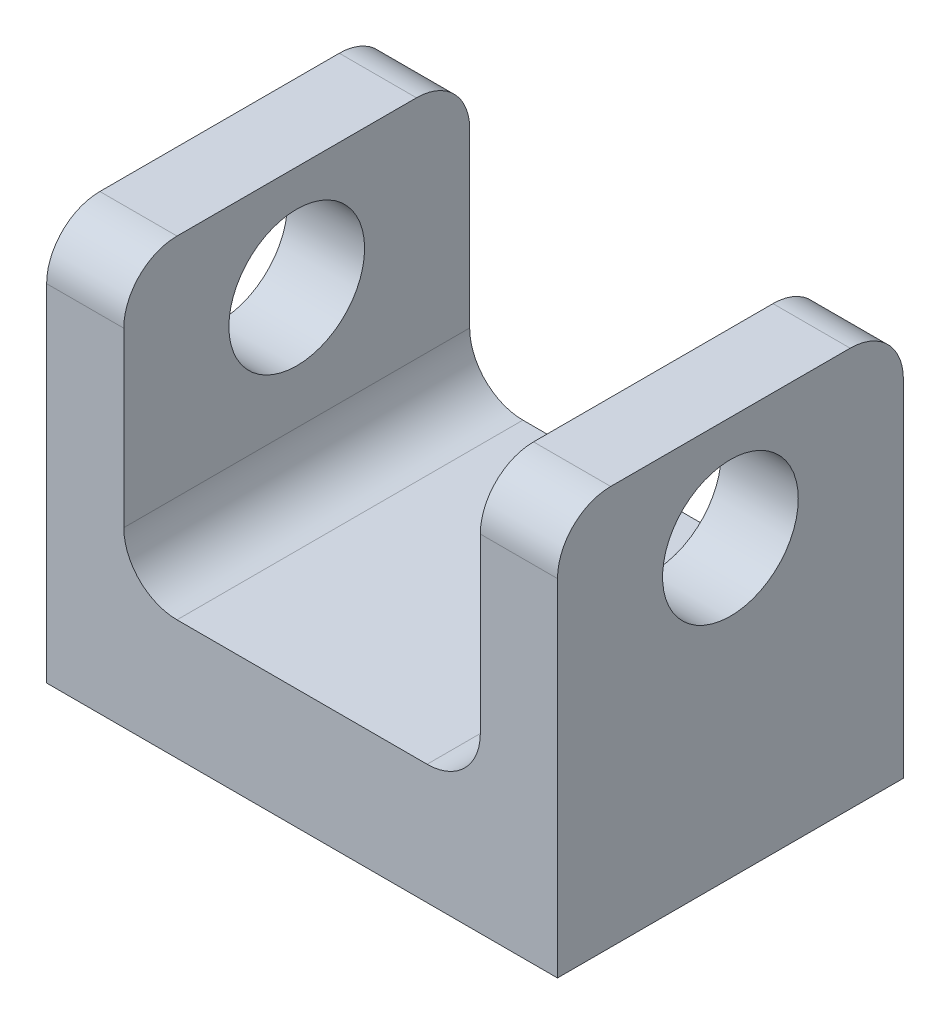
ISO-10303-21;
HEADER;
FILE_DESCRIPTION(('STEP AP214'),'2;1');
FILE_NAME('part.step','',(''),(''),'','','');
FILE_SCHEMA(('AUTOMOTIVE_DESIGN { 1 0 10303 214 1 1 1 1 }'));
ENDSEC;
DATA;
#1=APPLICATION_CONTEXT('core data for automotive mechanical design processes');
#2=APPLICATION_PROTOCOL_DEFINITION('international standard','automotive_design',2000,#1);
#3=PRODUCT_CONTEXT('',#1,'mechanical');
#4=PRODUCT('Part','Part','',(#3));
#5=PRODUCT_RELATED_PRODUCT_CATEGORY('part','',(#4));
#6=PRODUCT_DEFINITION_FORMATION('','',#4);
#7=PRODUCT_DEFINITION_CONTEXT('part definition',#1,'design');
#8=PRODUCT_DEFINITION('design','',#6,#7);
#9=PRODUCT_DEFINITION_SHAPE('','',#8);
#10=(LENGTH_UNIT() NAMED_UNIT(*) SI_UNIT(.MILLI.,.METRE.));
#11=(NAMED_UNIT(*) PLANE_ANGLE_UNIT() SI_UNIT($,.RADIAN.));
#12=(NAMED_UNIT(*) SI_UNIT($,.STERADIAN.) SOLID_ANGLE_UNIT());
#13=UNCERTAINTY_MEASURE_WITH_UNIT(LENGTH_MEASURE(1.E-05),#10,'distance_accuracy_value','');
#14=(GEOMETRIC_REPRESENTATION_CONTEXT(3) GLOBAL_UNCERTAINTY_ASSIGNED_CONTEXT((#13)) GLOBAL_UNIT_ASSIGNED_CONTEXT((#10,
#11,#12)) REPRESENTATION_CONTEXT('',''));
#15=CARTESIAN_POINT('',(0.,0.,0.));
#16=DIRECTION('',(0.,0.,1.));
#17=DIRECTION('',(1.,0.,0.));
#18=AXIS2_PLACEMENT_3D('',#15,#16,#17);
#19=CARTESIAN_POINT('',(-48.,37.5,65.));
#20=DIRECTION('',(0.,-1.,0.));
#21=DIRECTION('',(0.,0.,-1.));
#22=AXIS2_PLACEMENT_3D('',#19,#20,#21);
#23=PLANE('',#22);
#24=DIRECTION('',(0.,0.,-1.));
#25=VECTOR('',#24,1.);
#26=CARTESIAN_POINT('',(48.,37.5,65.));
#27=LINE('',#26,#25);
#28=CARTESIAN_POINT('',(48.,37.5,55.));
#29=VERTEX_POINT('',#28);
#30=CARTESIAN_POINT('',(48.,37.5,10.));
#31=VERTEX_POINT('',#30);
#32=EDGE_CURVE('E186',#29,#31,#27,.T.);
#33=ORIENTED_EDGE('',*,*,#32,.T.);
#34=DIRECTION('',(-1.,0.,0.));
#35=VECTOR('',#34,1.);
#36=CARTESIAN_POINT('',(33.5,37.5,10.));
#37=LINE('',#36,#35);
#38=CARTESIAN_POINT('',(33.5,37.5,10.));
#39=VERTEX_POINT('',#38);
#40=EDGE_CURVE('E203',#31,#39,#37,.T.);
#41=ORIENTED_EDGE('',*,*,#40,.T.);
#42=DIRECTION('',(0.,0.,1.));
#43=VECTOR('',#42,1.);
#44=CARTESIAN_POINT('',(33.5,37.5,65.));
#45=LINE('',#44,#43);
#46=CARTESIAN_POINT('',(33.5,37.5,55.));
#47=VERTEX_POINT('',#46);
#48=EDGE_CURVE('E178',#39,#47,#45,.T.);
#49=ORIENTED_EDGE('',*,*,#48,.T.);
#50=DIRECTION('',(-1.,0.,0.));
#51=VECTOR('',#50,1.);
#52=CARTESIAN_POINT('',(-48.,37.5,55.));
#53=LINE('',#52,#51);
#54=EDGE_CURVE('E194',#47,#29,#53,.F.);
#55=ORIENTED_EDGE('',*,*,#54,.T.);
#56=EDGE_LOOP('',(#33,#41,#49,#55));
#57=FACE_BOUND('',#56,.T.);
#58=ADVANCED_FACE('F39',(#57),#23,.F.);
#59=CARTESIAN_POINT('',(48.,-37.5,65.));
#60=DIRECTION('',(-1.,0.,0.));
#61=DIRECTION('',(0.,0.,1.));
#62=AXIS2_PLACEMENT_3D('',#59,#60,#61);
#63=PLANE('',#62);
#64=CARTESIAN_POINT('',(48.,17.8788932518614,32.5));
#65=DIRECTION('',(1.,0.,0.));
#66=DIRECTION('',(0.,0.,-1.));
#67=AXIS2_PLACEMENT_3D('',#64,#65,#66);
#68=CIRCLE('',#67,12.75);
#69=CARTESIAN_POINT('',(48.,17.8788932518614,19.75));
#70=VERTEX_POINT('',#69);
#71=EDGE_CURVE('E500',#70,#70,#68,.T.);
#72=ORIENTED_EDGE('',*,*,#71,.F.);
#73=EDGE_LOOP('',(#72));
#74=FACE_BOUND('',#73,.T.);
#75=DIRECTION('',(0.,1.,0.));
#76=VECTOR('',#75,1.);
#77=CARTESIAN_POINT('',(48.,-37.5,0.));
#78=LINE('',#77,#76);
#79=CARTESIAN_POINT('',(48.,-37.5,0.));
#80=VERTEX_POINT('',#79);
#81=CARTESIAN_POINT('',(48.,27.5,0.));
#82=VERTEX_POINT('',#81);
#83=EDGE_CURVE('E174',#80,#82,#78,.T.);
#84=ORIENTED_EDGE('',*,*,#83,.T.);
#85=CARTESIAN_POINT('',(48.,27.5,10.));
#86=DIRECTION('',(-1.,0.,0.));
#87=DIRECTION('',(0.,0.,1.));
#88=AXIS2_PLACEMENT_3D('',#85,#86,#87);
#89=CIRCLE('',#88,10.);
#90=EDGE_CURVE('E226',#82,#31,#89,.F.);
#91=ORIENTED_EDGE('',*,*,#90,.T.);
#92=ORIENTED_EDGE('',*,*,#32,.F.);
#93=CARTESIAN_POINT('',(48.,27.5,55.));
#94=DIRECTION('',(-1.,0.,0.));
#95=DIRECTION('',(0.,0.,1.));
#96=AXIS2_PLACEMENT_3D('',#93,#94,#95);
#97=CIRCLE('',#96,10.);
#98=CARTESIAN_POINT('',(48.,27.5,65.));
#99=VERTEX_POINT('',#98);
#100=EDGE_CURVE('E223',#29,#99,#97,.F.);
#101=ORIENTED_EDGE('',*,*,#100,.T.);
#102=DIRECTION('',(0.,1.,0.));
#103=VECTOR('',#102,1.);
#104=CARTESIAN_POINT('',(48.,-37.5,65.));
#105=LINE('',#104,#103);
#106=CARTESIAN_POINT('',(48.,-37.5,65.));
#107=VERTEX_POINT('',#106);
#108=EDGE_CURVE('E152',#107,#99,#105,.T.);
#109=ORIENTED_EDGE('',*,*,#108,.F.);
#110=DIRECTION('',(0.,0.,-1.));
#111=VECTOR('',#110,1.);
#112=CARTESIAN_POINT('',(48.,-37.5,65.));
#113=LINE('',#112,#111);
#114=EDGE_CURVE('E163',#107,#80,#113,.T.);
#115=ORIENTED_EDGE('',*,*,#114,.T.);
#116=EDGE_LOOP('',(#84,#91,#92,#101,#109,#115));
#117=FACE_BOUND('',#116,.T.);
#118=ADVANCED_FACE('F345',(#74,#117),#63,.F.);
#119=DIRECTION('',(0.,0.,-1.));
#120=VECTOR('',#119,1.);
#121=CARTESIAN_POINT('',(-33.5,37.5,65.));
#122=LINE('',#121,#120);
#123=CARTESIAN_POINT('',(-33.5,37.5,55.));
#124=VERTEX_POINT('',#123);
#125=CARTESIAN_POINT('',(-33.5,37.5,10.));
#126=VERTEX_POINT('',#125);
#127=EDGE_CURVE('E295',#124,#126,#122,.T.);
#128=ORIENTED_EDGE('',*,*,#127,.T.);
#129=DIRECTION('',(-1.,0.,0.));
#130=VECTOR('',#129,1.);
#131=CARTESIAN_POINT('',(-48.,37.5,10.));
#132=LINE('',#131,#130);
#133=CARTESIAN_POINT('',(-48.,37.5,10.));
#134=VERTEX_POINT('',#133);
#135=EDGE_CURVE('E238',#126,#134,#132,.T.);
#136=ORIENTED_EDGE('',*,*,#135,.T.);
#137=DIRECTION('',(0.,0.,-1.));
#138=VECTOR('',#137,1.);
#139=CARTESIAN_POINT('',(-48.,37.5,65.));
#140=LINE('',#139,#138);
#141=CARTESIAN_POINT('',(-48.,37.5,55.));
#142=VERTEX_POINT('',#141);
#143=EDGE_CURVE('E162',#142,#134,#140,.T.);
#144=ORIENTED_EDGE('',*,*,#143,.F.);
#145=DIRECTION('',(-1.,0.,0.));
#146=VECTOR('',#145,1.);
#147=CARTESIAN_POINT('',(-48.,37.5,55.));
#148=LINE('',#147,#146);
#149=EDGE_CURVE('E235',#142,#124,#148,.F.);
#150=ORIENTED_EDGE('',*,*,#149,.T.);
#151=EDGE_LOOP('',(#128,#136,#144,#150));
#152=FACE_BOUND('',#151,.T.);
#153=ADVANCED_FACE('F347',(#152),#23,.F.);
#154=CARTESIAN_POINT('',(-48.,-37.5,65.));
#155=DIRECTION('',(1.,0.,0.));
#156=DIRECTION('',(0.,0.,-1.));
#157=AXIS2_PLACEMENT_3D('',#154,#155,#156);
#158=PLANE('',#157);
#159=CARTESIAN_POINT('',(-48.,17.8788932518614,32.5));
#160=DIRECTION('',(1.,0.,0.));
#161=DIRECTION('',(0.,0.,-1.));
#162=AXIS2_PLACEMENT_3D('',#159,#160,#161);
#163=CIRCLE('',#162,12.75);
#164=CARTESIAN_POINT('',(-48.,17.8788932518614,19.75));
#165=VERTEX_POINT('',#164);
#166=EDGE_CURVE('E200',#165,#165,#163,.T.);
#167=ORIENTED_EDGE('',*,*,#166,.T.);
#168=EDGE_LOOP('',(#167));
#169=FACE_BOUND('',#168,.T.);
#170=ORIENTED_EDGE('',*,*,#143,.T.);
#171=CARTESIAN_POINT('',(-48.,27.5,10.));
#172=DIRECTION('',(1.,0.,0.));
#173=DIRECTION('',(0.,0.,-1.));
#174=AXIS2_PLACEMENT_3D('',#171,#172,#173);
#175=CIRCLE('',#174,10.);
#176=CARTESIAN_POINT('',(-48.,27.5,0.));
#177=VERTEX_POINT('',#176);
#178=EDGE_CURVE('E55',#134,#177,#175,.F.);
#179=ORIENTED_EDGE('',*,*,#178,.T.);
#180=DIRECTION('',(0.,-1.,0.));
#181=VECTOR('',#180,1.);
#182=CARTESIAN_POINT('',(-48.,-37.5,0.));
#183=LINE('',#182,#181);
#184=CARTESIAN_POINT('',(-48.,-37.5,0.));
#185=VERTEX_POINT('',#184);
#186=EDGE_CURVE('E158',#177,#185,#183,.T.);
#187=ORIENTED_EDGE('',*,*,#186,.T.);
#188=DIRECTION('',(0.,0.,-1.));
#189=VECTOR('',#188,1.);
#190=CARTESIAN_POINT('',(-48.,-37.5,65.));
#191=LINE('',#190,#189);
#192=CARTESIAN_POINT('',(-48.,-37.5,65.));
#193=VERTEX_POINT('',#192);
#194=EDGE_CURVE('E155',#193,#185,#191,.T.);
#195=ORIENTED_EDGE('',*,*,#194,.F.);
#196=DIRECTION('',(0.,-1.,0.));
#197=VECTOR('',#196,1.);
#198=CARTESIAN_POINT('',(-48.,-37.5,65.));
#199=LINE('',#198,#197);
#200=CARTESIAN_POINT('',(-48.,27.5,65.));
#201=VERTEX_POINT('',#200);
#202=EDGE_CURVE('E141',#201,#193,#199,.T.);
#203=ORIENTED_EDGE('',*,*,#202,.F.);
#204=CARTESIAN_POINT('',(-48.,27.5,55.));
#205=DIRECTION('',(1.,0.,0.));
#206=DIRECTION('',(0.,0.,-1.));
#207=AXIS2_PLACEMENT_3D('',#204,#205,#206);
#208=CIRCLE('',#207,10.);
#209=EDGE_CURVE('E63',#201,#142,#208,.F.);
#210=ORIENTED_EDGE('',*,*,#209,.T.);
#211=EDGE_LOOP('',(#170,#179,#187,#195,#203,#210));
#212=FACE_BOUND('',#211,.T.);
#213=ADVANCED_FACE('F156',(#169,#212),#158,.F.);
#214=CARTESIAN_POINT('',(-48.,-37.5,65.));
#215=DIRECTION('',(0.,1.,0.));
#216=DIRECTION('',(0.,0.,1.));
#217=AXIS2_PLACEMENT_3D('',#214,#215,#216);
#218=PLANE('',#217);
#219=DIRECTION('',(1.,0.,0.));
#220=VECTOR('',#219,1.);
#221=CARTESIAN_POINT('',(-48.,-37.5,0.));
#222=LINE('',#221,#220);
#223=EDGE_CURVE('E181',#185,#80,#222,.T.);
#224=ORIENTED_EDGE('',*,*,#223,.T.);
#225=ORIENTED_EDGE('',*,*,#114,.F.);
#226=DIRECTION('',(1.,0.,0.));
#227=VECTOR('',#226,1.);
#228=CARTESIAN_POINT('',(-48.,-37.5,65.));
#229=LINE('',#228,#227);
#230=EDGE_CURVE('E146',#193,#107,#229,.T.);
#231=ORIENTED_EDGE('',*,*,#230,.F.);
#232=ORIENTED_EDGE('',*,*,#194,.T.);
#233=EDGE_LOOP('',(#224,#225,#231,#232));
#234=FACE_BOUND('',#233,.T.);
#235=ADVANCED_FACE('F165',(#234),#218,.F.);
#236=CARTESIAN_POINT('',(0.,0.,65.));
#237=DIRECTION('',(0.,0.,-1.));
#238=DIRECTION('',(-1.,0.,0.));
#239=AXIS2_PLACEMENT_3D('',#236,#237,#238);
#240=PLANE('',#239);
#241=ORIENTED_EDGE('',*,*,#108,.T.);
#242=DIRECTION('',(-1.,0.,0.));
#243=VECTOR('',#242,1.);
#244=CARTESIAN_POINT('',(0.,27.5,65.));
#245=LINE('',#244,#243);
#246=CARTESIAN_POINT('',(33.5,27.5,65.));
#247=VERTEX_POINT('',#246);
#248=EDGE_CURVE('E231',#99,#247,#245,.T.);
#249=ORIENTED_EDGE('',*,*,#248,.T.);
#250=DIRECTION('',(0.,1.,0.));
#251=VECTOR('',#250,1.);
#252=CARTESIAN_POINT('',(33.5,-14.9602041854541,65.));
#253=LINE('',#252,#251);
#254=CARTESIAN_POINT('',(33.5,-4.96020418545413,65.));
#255=VERTEX_POINT('',#254);
#256=EDGE_CURVE('E281',#255,#247,#253,.T.);
#257=ORIENTED_EDGE('',*,*,#256,.F.);
#258=CARTESIAN_POINT('',(23.5,-4.96020418545413,65.));
#259=DIRECTION('',(0.,0.,-1.));
#260=DIRECTION('',(-1.,0.,0.));
#261=AXIS2_PLACEMENT_3D('',#258,#259,#260);
#262=CIRCLE('',#261,10.);
#263=CARTESIAN_POINT('',(23.5,-14.9602041854541,65.));
#264=VERTEX_POINT('',#263);
#265=EDGE_CURVE('E261',#255,#264,#262,.T.);
#266=ORIENTED_EDGE('',*,*,#265,.T.);
#267=DIRECTION('',(1.,0.,0.));
#268=VECTOR('',#267,1.);
#269=CARTESIAN_POINT('',(-33.5,-14.9602041854541,65.));
#270=LINE('',#269,#268);
#271=CARTESIAN_POINT('',(-23.5,-14.9602041854541,65.));
#272=VERTEX_POINT('',#271);
#273=EDGE_CURVE('E271',#272,#264,#270,.T.);
#274=ORIENTED_EDGE('',*,*,#273,.F.);
#275=CARTESIAN_POINT('',(-23.5,-4.96020418545413,65.));
#276=DIRECTION('',(0.,0.,-1.));
#277=DIRECTION('',(-1.,0.,0.));
#278=AXIS2_PLACEMENT_3D('',#275,#276,#277);
#279=CIRCLE('',#278,10.);
#280=CARTESIAN_POINT('',(-33.5,-4.96020418545413,65.));
#281=VERTEX_POINT('',#280);
#282=EDGE_CURVE('E48',#272,#281,#279,.T.);
#283=ORIENTED_EDGE('',*,*,#282,.T.);
#284=DIRECTION('',(0.,-1.,0.));
#285=VECTOR('',#284,1.);
#286=CARTESIAN_POINT('',(-33.5,-14.9602041854541,65.));
#287=LINE('',#286,#285);
#288=CARTESIAN_POINT('',(-33.5,27.5,65.));
#289=VERTEX_POINT('',#288);
#290=EDGE_CURVE('E269',#289,#281,#287,.T.);
#291=ORIENTED_EDGE('',*,*,#290,.F.);
#292=DIRECTION('',(-1.,0.,0.));
#293=VECTOR('',#292,1.);
#294=CARTESIAN_POINT('',(0.,27.5,65.));
#295=LINE('',#294,#293);
#296=EDGE_CURVE('E150',#289,#201,#295,.T.);
#297=ORIENTED_EDGE('',*,*,#296,.T.);
#298=ORIENTED_EDGE('',*,*,#202,.T.);
#299=ORIENTED_EDGE('',*,*,#230,.T.);
#300=EDGE_LOOP('',(#241,#249,#257,#266,#274,#283,#291,#297,#298,#299));
#301=FACE_BOUND('',#300,.T.);
#302=ADVANCED_FACE('F144',(#301),#240,.F.);
#303=CARTESIAN_POINT('',(0.,0.,0.));
#304=DIRECTION('',(0.,0.,-1.));
#305=DIRECTION('',(-1.,0.,0.));
#306=AXIS2_PLACEMENT_3D('',#303,#304,#305);
#307=PLANE('',#306);
#308=DIRECTION('',(0.,1.,0.));
#309=VECTOR('',#308,1.);
#310=CARTESIAN_POINT('',(33.5,-14.9602041854541,0.));
#311=LINE('',#310,#309);
#312=CARTESIAN_POINT('',(33.5,-4.96020418545413,0.));
#313=VERTEX_POINT('',#312);
#314=CARTESIAN_POINT('',(33.5,27.5,0.));
#315=VERTEX_POINT('',#314);
#316=EDGE_CURVE('E296',#313,#315,#311,.T.);
#317=ORIENTED_EDGE('',*,*,#316,.T.);
#318=DIRECTION('',(-1.,0.,0.));
#319=VECTOR('',#318,1.);
#320=CARTESIAN_POINT('',(48.,27.5,0.));
#321=LINE('',#320,#319);
#322=EDGE_CURVE('E220',#315,#82,#321,.F.);
#323=ORIENTED_EDGE('',*,*,#322,.T.);
#324=ORIENTED_EDGE('',*,*,#83,.F.);
#325=ORIENTED_EDGE('',*,*,#223,.F.);
#326=ORIENTED_EDGE('',*,*,#186,.F.);
#327=DIRECTION('',(-1.,0.,0.));
#328=VECTOR('',#327,1.);
#329=CARTESIAN_POINT('',(-33.5,27.5,0.));
#330=LINE('',#329,#328);
#331=CARTESIAN_POINT('',(-33.5,27.5,0.));
#332=VERTEX_POINT('',#331);
#333=EDGE_CURVE('E217',#177,#332,#330,.F.);
#334=ORIENTED_EDGE('',*,*,#333,.T.);
#335=DIRECTION('',(0.,1.,0.));
#336=VECTOR('',#335,1.);
#337=CARTESIAN_POINT('',(-33.5,0.,0.));
#338=LINE('',#337,#336);
#339=CARTESIAN_POINT('',(-33.5,-4.96020418545413,0.));
#340=VERTEX_POINT('',#339);
#341=EDGE_CURVE('E190',#340,#332,#338,.T.);
#342=ORIENTED_EDGE('',*,*,#341,.F.);
#343=CARTESIAN_POINT('',(-23.5,-4.96020418545413,0.));
#344=DIRECTION('',(0.,0.,-1.));
#345=DIRECTION('',(-1.,0.,0.));
#346=AXIS2_PLACEMENT_3D('',#343,#344,#345);
#347=CIRCLE('',#346,10.);
#348=CARTESIAN_POINT('',(-23.5,-14.9602041854541,0.));
#349=VERTEX_POINT('',#348);
#350=EDGE_CURVE('E11',#340,#349,#347,.F.);
#351=ORIENTED_EDGE('',*,*,#350,.T.);
#352=DIRECTION('',(1.,0.,0.));
#353=VECTOR('',#352,1.);
#354=CARTESIAN_POINT('',(-33.5,-14.9602041854541,0.));
#355=LINE('',#354,#353);
#356=CARTESIAN_POINT('',(23.5,-14.9602041854541,0.));
#357=VERTEX_POINT('',#356);
#358=EDGE_CURVE('E289',#349,#357,#355,.T.);
#359=ORIENTED_EDGE('',*,*,#358,.T.);
#360=CARTESIAN_POINT('',(23.5,-4.96020418545413,0.));
#361=DIRECTION('',(0.,0.,-1.));
#362=DIRECTION('',(-1.,0.,0.));
#363=AXIS2_PLACEMENT_3D('',#360,#361,#362);
#364=CIRCLE('',#363,10.);
#365=EDGE_CURVE('E264',#357,#313,#364,.F.);
#366=ORIENTED_EDGE('',*,*,#365,.T.);
#367=EDGE_LOOP('',(#317,#323,#324,#325,#326,#334,#342,#351,#359,#366));
#368=FACE_BOUND('',#367,.T.);
#369=ADVANCED_FACE('F288',(#368),#307,.T.);
#370=CARTESIAN_POINT('',(33.5,-14.9602041854541,0.));
#371=DIRECTION('',(1.,0.,0.));
#372=DIRECTION('',(0.,0.,-1.));
#373=AXIS2_PLACEMENT_3D('',#370,#371,#372);
#374=PLANE('',#373);
#375=CARTESIAN_POINT('',(33.5,17.8788932518614,32.5));
#376=DIRECTION('',(1.,0.,0.));
#377=DIRECTION('',(0.,0.,-1.));
#378=AXIS2_PLACEMENT_3D('',#375,#376,#377);
#379=CIRCLE('',#378,12.75);
#380=CARTESIAN_POINT('',(33.5,17.8788932518614,19.75));
#381=VERTEX_POINT('',#380);
#382=EDGE_CURVE('E199',#381,#381,#379,.T.);
#383=ORIENTED_EDGE('',*,*,#382,.T.);
#384=EDGE_LOOP('',(#383));
#385=FACE_BOUND('',#384,.T.);
#386=ORIENTED_EDGE('',*,*,#48,.F.);
#387=CARTESIAN_POINT('',(33.5,27.5,10.));
#388=DIRECTION('',(1.,0.,0.));
#389=DIRECTION('',(0.,0.,-1.));
#390=AXIS2_PLACEMENT_3D('',#387,#388,#389);
#391=CIRCLE('',#390,10.);
#392=EDGE_CURVE('E214',#39,#315,#391,.F.);
#393=ORIENTED_EDGE('',*,*,#392,.T.);
#394=ORIENTED_EDGE('',*,*,#316,.F.);
#395=DIRECTION('',(0.,0.,1.));
#396=VECTOR('',#395,1.);
#397=CARTESIAN_POINT('',(33.5,-4.96020418545413,65.));
#398=LINE('',#397,#396);
#399=EDGE_CURVE('E207',#313,#255,#398,.T.);
#400=ORIENTED_EDGE('',*,*,#399,.T.);
#401=ORIENTED_EDGE('',*,*,#256,.T.);
#402=CARTESIAN_POINT('',(33.5,27.5,55.));
#403=DIRECTION('',(1.,0.,0.));
#404=DIRECTION('',(0.,0.,-1.));
#405=AXIS2_PLACEMENT_3D('',#402,#403,#404);
#406=CIRCLE('',#405,10.);
#407=EDGE_CURVE('E211',#247,#47,#406,.F.);
#408=ORIENTED_EDGE('',*,*,#407,.T.);
#409=EDGE_LOOP('',(#386,#393,#394,#400,#401,#408));
#410=FACE_BOUND('',#409,.T.);
#411=ADVANCED_FACE('F322',(#385,#410),#374,.F.);
#412=CARTESIAN_POINT('',(-33.5,-14.9602041854541,0.));
#413=DIRECTION('',(-1.,0.,0.));
#414=DIRECTION('',(0.,0.,1.));
#415=AXIS2_PLACEMENT_3D('',#412,#413,#414);
#416=PLANE('',#415);
#417=CARTESIAN_POINT('',(-33.5,17.8788932518614,32.5));
#418=DIRECTION('',(-1.,0.,0.));
#419=DIRECTION('',(0.,0.,1.));
#420=AXIS2_PLACEMENT_3D('',#417,#418,#419);
#421=CIRCLE('',#420,12.75);
#422=CARTESIAN_POINT('',(-33.5,17.8788932518614,45.25));
#423=VERTEX_POINT('',#422);
#424=EDGE_CURVE('E195',#423,#423,#421,.T.);
#425=ORIENTED_EDGE('',*,*,#424,.T.);
#426=EDGE_LOOP('',(#425));
#427=FACE_BOUND('',#426,.T.);
#428=ORIENTED_EDGE('',*,*,#341,.T.);
#429=CARTESIAN_POINT('',(-33.5,27.5,10.));
#430=DIRECTION('',(-1.,0.,0.));
#431=DIRECTION('',(0.,0.,1.));
#432=AXIS2_PLACEMENT_3D('',#429,#430,#431);
#433=CIRCLE('',#432,10.);
#434=EDGE_CURVE('E251',#332,#126,#433,.F.);
#435=ORIENTED_EDGE('',*,*,#434,.T.);
#436=ORIENTED_EDGE('',*,*,#127,.F.);
#437=CARTESIAN_POINT('',(-33.5,27.5,55.));
#438=DIRECTION('',(-1.,0.,0.));
#439=DIRECTION('',(0.,0.,1.));
#440=AXIS2_PLACEMENT_3D('',#437,#438,#439);
#441=CIRCLE('',#440,10.);
#442=EDGE_CURVE('E248',#124,#289,#441,.F.);
#443=ORIENTED_EDGE('',*,*,#442,.T.);
#444=ORIENTED_EDGE('',*,*,#290,.T.);
#445=DIRECTION('',(0.,0.,1.));
#446=VECTOR('',#445,1.);
#447=CARTESIAN_POINT('',(-33.5,-4.96020418545413,0.));
#448=LINE('',#447,#446);
#449=EDGE_CURVE('E245',#281,#340,#448,.F.);
#450=ORIENTED_EDGE('',*,*,#449,.T.);
#451=EDGE_LOOP('',(#428,#435,#436,#443,#444,#450));
#452=FACE_BOUND('',#451,.T.);
#453=ADVANCED_FACE('F276',(#427,#452),#416,.F.);
#454=CARTESIAN_POINT('',(-33.5,-14.9602041854541,0.));
#455=DIRECTION('',(0.,-1.,0.));
#456=DIRECTION('',(0.,0.,-1.));
#457=AXIS2_PLACEMENT_3D('',#454,#455,#456);
#458=PLANE('',#457);
#459=ORIENTED_EDGE('',*,*,#273,.T.);
#460=DIRECTION('',(0.,0.,1.));
#461=VECTOR('',#460,1.);
#462=CARTESIAN_POINT('',(23.5,-14.9602041854541,0.));
#463=LINE('',#462,#461);
#464=EDGE_CURVE('E258',#264,#357,#463,.F.);
#465=ORIENTED_EDGE('',*,*,#464,.T.);
#466=ORIENTED_EDGE('',*,*,#358,.F.);
#467=DIRECTION('',(0.,0.,1.));
#468=VECTOR('',#467,1.);
#469=CARTESIAN_POINT('',(-23.5,-14.9602041854541,65.));
#470=LINE('',#469,#468);
#471=EDGE_CURVE('E254',#349,#272,#470,.T.);
#472=ORIENTED_EDGE('',*,*,#471,.T.);
#473=EDGE_LOOP('',(#459,#465,#466,#472));
#474=FACE_BOUND('',#473,.T.);
#475=ADVANCED_FACE('F292',(#474),#458,.F.);
#476=CARTESIAN_POINT('',(-48.,17.8788932518614,32.5));
#477=DIRECTION('',(1.,0.,0.));
#478=DIRECTION('',(0.,0.,-1.));
#479=AXIS2_PLACEMENT_3D('',#476,#477,#478);
#480=CYLINDRICAL_SURFACE('',#479,12.75);
#481=ORIENTED_EDGE('',*,*,#166,.F.);
#482=EDGE_LOOP('',(#481));
#483=FACE_BOUND('',#482,.T.);
#484=ORIENTED_EDGE('',*,*,#424,.F.);
#485=EDGE_LOOP('',(#484));
#486=FACE_BOUND('',#485,.T.);
#487=ADVANCED_FACE('F374',(#483,#486),#480,.F.);
#488=ORIENTED_EDGE('',*,*,#71,.T.);
#489=EDGE_LOOP('',(#488));
#490=FACE_BOUND('',#489,.T.);
#491=ORIENTED_EDGE('',*,*,#382,.F.);
#492=EDGE_LOOP('',(#491));
#493=FACE_BOUND('',#492,.T.);
#494=ADVANCED_FACE('F370',(#490,#493),#480,.F.);
#495=CARTESIAN_POINT('',(-48.,27.5,10.));
#496=DIRECTION('',(1.,0.,0.));
#497=DIRECTION('',(0.,0.,-1.));
#498=AXIS2_PLACEMENT_3D('',#495,#496,#497);
#499=CYLINDRICAL_SURFACE('',#498,10.);
#500=ORIENTED_EDGE('',*,*,#90,.F.);
#501=ORIENTED_EDGE('',*,*,#322,.F.);
#502=ORIENTED_EDGE('',*,*,#392,.F.);
#503=ORIENTED_EDGE('',*,*,#40,.F.);
#504=EDGE_LOOP('',(#500,#501,#502,#503));
#505=FACE_BOUND('',#504,.T.);
#506=ADVANCED_FACE('F328',(#505),#499,.T.);
#507=CARTESIAN_POINT('',(0.,27.5,55.));
#508=DIRECTION('',(-1.,0.,0.));
#509=DIRECTION('',(0.,0.,1.));
#510=AXIS2_PLACEMENT_3D('',#507,#508,#509);
#511=CYLINDRICAL_SURFACE('',#510,10.);
#512=ORIENTED_EDGE('',*,*,#100,.F.);
#513=ORIENTED_EDGE('',*,*,#54,.F.);
#514=ORIENTED_EDGE('',*,*,#407,.F.);
#515=ORIENTED_EDGE('',*,*,#248,.F.);
#516=EDGE_LOOP('',(#512,#513,#514,#515));
#517=FACE_BOUND('',#516,.T.);
#518=ADVANCED_FACE('F318',(#517),#511,.T.);
#519=CARTESIAN_POINT('',(-48.,27.5,10.));
#520=DIRECTION('',(1.,0.,0.));
#521=DIRECTION('',(0.,0.,-1.));
#522=AXIS2_PLACEMENT_3D('',#519,#520,#521);
#523=CYLINDRICAL_SURFACE('',#522,10.);
#524=ORIENTED_EDGE('',*,*,#434,.F.);
#525=ORIENTED_EDGE('',*,*,#333,.F.);
#526=ORIENTED_EDGE('',*,*,#178,.F.);
#527=ORIENTED_EDGE('',*,*,#135,.F.);
#528=EDGE_LOOP('',(#524,#525,#526,#527));
#529=FACE_BOUND('',#528,.T.);
#530=ADVANCED_FACE('F341',(#529),#523,.T.);
#531=CARTESIAN_POINT('',(0.,27.5,55.));
#532=DIRECTION('',(-1.,0.,0.));
#533=DIRECTION('',(0.,0.,1.));
#534=AXIS2_PLACEMENT_3D('',#531,#532,#533);
#535=CYLINDRICAL_SURFACE('',#534,10.);
#536=ORIENTED_EDGE('',*,*,#442,.F.);
#537=ORIENTED_EDGE('',*,*,#149,.F.);
#538=ORIENTED_EDGE('',*,*,#209,.F.);
#539=ORIENTED_EDGE('',*,*,#296,.F.);
#540=EDGE_LOOP('',(#536,#537,#538,#539));
#541=FACE_BOUND('',#540,.T.);
#542=ADVANCED_FACE('F336',(#541),#535,.T.);
#543=CARTESIAN_POINT('',(23.5,-4.96020418545413,0.));
#544=DIRECTION('',(0.,0.,-1.));
#545=DIRECTION('',(-1.,0.,0.));
#546=AXIS2_PLACEMENT_3D('',#543,#544,#545);
#547=CYLINDRICAL_SURFACE('',#546,10.);
#548=ORIENTED_EDGE('',*,*,#365,.F.);
#549=ORIENTED_EDGE('',*,*,#464,.F.);
#550=ORIENTED_EDGE('',*,*,#265,.F.);
#551=ORIENTED_EDGE('',*,*,#399,.F.);
#552=EDGE_LOOP('',(#548,#549,#550,#551));
#553=FACE_BOUND('',#552,.T.);
#554=ADVANCED_FACE('F334',(#553),#547,.F.);
#555=CARTESIAN_POINT('',(-23.5,-4.96020418545413,0.));
#556=DIRECTION('',(0.,0.,-1.));
#557=DIRECTION('',(-1.,0.,0.));
#558=AXIS2_PLACEMENT_3D('',#555,#556,#557);
#559=CYLINDRICAL_SURFACE('',#558,10.);
#560=ORIENTED_EDGE('',*,*,#350,.F.);
#561=ORIENTED_EDGE('',*,*,#449,.F.);
#562=ORIENTED_EDGE('',*,*,#282,.F.);
#563=ORIENTED_EDGE('',*,*,#471,.F.);
#564=EDGE_LOOP('',(#560,#561,#562,#563));
#565=FACE_BOUND('',#564,.T.);
#566=ADVANCED_FACE('F41',(#565),#559,.F.);
#567=CLOSED_SHELL('',(#58,#118,#153,#213,#235,#302,#369,#411,#453,#475,#487,#494,#506,#518,#530,
#542,#554,#566));
#568=MANIFOLD_SOLID_BREP('B2',#567);
#569=ADVANCED_BREP_SHAPE_REPRESENTATION('',(#18,#568),#14);
#570=SHAPE_DEFINITION_REPRESENTATION(#9,#569);
ENDSEC;
END-ISO-10303-21;
